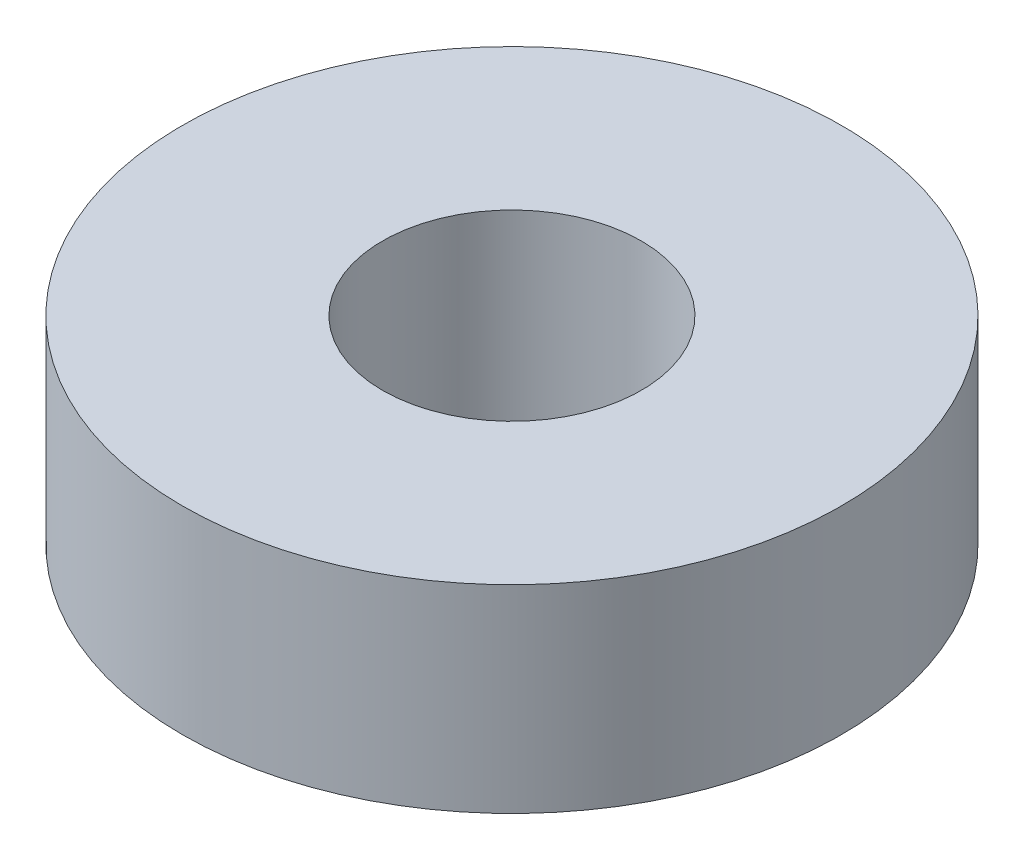
ISO-10303-21;
HEADER;
FILE_DESCRIPTION(('STEP AP214'),'2;1');
FILE_NAME('part.step','',(''),(''),'','','');
FILE_SCHEMA(('AUTOMOTIVE_DESIGN { 1 0 10303 214 1 1 1 1 }'));
ENDSEC;
DATA;
#1=APPLICATION_CONTEXT('core data for automotive mechanical design processes');
#2=APPLICATION_PROTOCOL_DEFINITION('international standard','automotive_design',2000,#1);
#3=PRODUCT_CONTEXT('',#1,'mechanical');
#4=PRODUCT('Part','Part','',(#3));
#5=PRODUCT_RELATED_PRODUCT_CATEGORY('part','',(#4));
#6=PRODUCT_DEFINITION_FORMATION('','',#4);
#7=PRODUCT_DEFINITION_CONTEXT('part definition',#1,'design');
#8=PRODUCT_DEFINITION('design','',#6,#7);
#9=PRODUCT_DEFINITION_SHAPE('','',#8);
#10=(LENGTH_UNIT() NAMED_UNIT(*) SI_UNIT(.MILLI.,.METRE.));
#11=(NAMED_UNIT(*) PLANE_ANGLE_UNIT() SI_UNIT($,.RADIAN.));
#12=(NAMED_UNIT(*) SI_UNIT($,.STERADIAN.) SOLID_ANGLE_UNIT());
#13=UNCERTAINTY_MEASURE_WITH_UNIT(LENGTH_MEASURE(1.E-05),#10,'distance_accuracy_value','');
#14=(GEOMETRIC_REPRESENTATION_CONTEXT(3) GLOBAL_UNCERTAINTY_ASSIGNED_CONTEXT((#13)) GLOBAL_UNIT_ASSIGNED_CONTEXT((#10,
#11,#12)) REPRESENTATION_CONTEXT('',''));
#15=CARTESIAN_POINT('',(0.,0.,0.));
#16=DIRECTION('',(0.,0.,1.));
#17=DIRECTION('',(1.,0.,0.));
#18=AXIS2_PLACEMENT_3D('',#15,#16,#17);
#19=CARTESIAN_POINT('',(0.,6.,0.));
#20=DIRECTION('',(0.,1.,0.));
#21=DIRECTION('',(0.,0.,1.));
#22=AXIS2_PLACEMENT_3D('',#19,#20,#21);
#23=PLANE('',#22);
#24=CARTESIAN_POINT('',(0.,6.,0.));
#25=DIRECTION('',(0.,1.,0.));
#26=DIRECTION('',(0.,0.,1.));
#27=AXIS2_PLACEMENT_3D('',#24,#25,#26);
#28=CIRCLE('',#27,9.98);
#29=CARTESIAN_POINT('',(0.,6.,9.98));
#30=VERTEX_POINT('',#29);
#31=EDGE_CURVE('E11',#30,#30,#28,.T.);
#32=ORIENTED_EDGE('',*,*,#31,.T.);
#33=EDGE_LOOP('',(#32));
#34=FACE_BOUND('',#33,.T.);
#35=CARTESIAN_POINT('',(0.,6.,0.));
#36=DIRECTION('',(0.,1.,0.));
#37=DIRECTION('',(0.,0.,1.));
#38=AXIS2_PLACEMENT_3D('',#35,#36,#37);
#39=CIRCLE('',#38,3.92);
#40=CARTESIAN_POINT('',(0.,6.,3.92));
#41=VERTEX_POINT('',#40);
#42=EDGE_CURVE('E45',#41,#41,#39,.T.);
#43=ORIENTED_EDGE('',*,*,#42,.F.);
#44=EDGE_LOOP('',(#43));
#45=FACE_BOUND('',#44,.T.);
#46=ADVANCED_FACE('F32',(#34,#45),#23,.T.);
#47=CARTESIAN_POINT('',(0.,0.,0.));
#48=DIRECTION('',(0.,1.,0.));
#49=DIRECTION('',(0.,0.,1.));
#50=AXIS2_PLACEMENT_3D('',#47,#48,#49);
#51=PLANE('',#50);
#52=CARTESIAN_POINT('',(0.,0.,0.));
#53=DIRECTION('',(0.,1.,0.));
#54=DIRECTION('',(0.,0.,1.));
#55=AXIS2_PLACEMENT_3D('',#52,#53,#54);
#56=CIRCLE('',#55,9.98);
#57=CARTESIAN_POINT('',(0.,0.,9.98));
#58=VERTEX_POINT('',#57);
#59=EDGE_CURVE('E40',#58,#58,#56,.T.);
#60=ORIENTED_EDGE('',*,*,#59,.F.);
#61=EDGE_LOOP('',(#60));
#62=FACE_BOUND('',#61,.T.);
#63=CARTESIAN_POINT('',(0.,0.,0.));
#64=DIRECTION('',(0.,1.,0.));
#65=DIRECTION('',(0.,0.,1.));
#66=AXIS2_PLACEMENT_3D('',#63,#64,#65);
#67=CIRCLE('',#66,3.92);
#68=CARTESIAN_POINT('',(0.,0.,3.92));
#69=VERTEX_POINT('',#68);
#70=EDGE_CURVE('E36',#69,#69,#67,.T.);
#71=ORIENTED_EDGE('',*,*,#70,.T.);
#72=EDGE_LOOP('',(#71));
#73=FACE_BOUND('',#72,.T.);
#74=ADVANCED_FACE('F53',(#62,#73),#51,.F.);
#75=CARTESIAN_POINT('',(0.,6.,0.));
#76=DIRECTION('',(0.,-1.,0.));
#77=DIRECTION('',(0.,0.,-1.));
#78=AXIS2_PLACEMENT_3D('',#75,#76,#77);
#79=CYLINDRICAL_SURFACE('',#78,9.98);
#80=ORIENTED_EDGE('',*,*,#31,.F.);
#81=EDGE_LOOP('',(#80));
#82=FACE_BOUND('',#81,.T.);
#83=ORIENTED_EDGE('',*,*,#59,.T.);
#84=EDGE_LOOP('',(#83));
#85=FACE_BOUND('',#84,.T.);
#86=ADVANCED_FACE('F56',(#82,#85),#79,.T.);
#87=CARTESIAN_POINT('',(0.,6.,0.));
#88=DIRECTION('',(0.,-1.,0.));
#89=DIRECTION('',(0.,0.,-1.));
#90=AXIS2_PLACEMENT_3D('',#87,#88,#89);
#91=CYLINDRICAL_SURFACE('',#90,3.92);
#92=ORIENTED_EDGE('',*,*,#42,.T.);
#93=EDGE_LOOP('',(#92));
#94=FACE_BOUND('',#93,.T.);
#95=ORIENTED_EDGE('',*,*,#70,.F.);
#96=EDGE_LOOP('',(#95));
#97=FACE_BOUND('',#96,.T.);
#98=ADVANCED_FACE('F34',(#94,#97),#91,.F.);
#99=CLOSED_SHELL('',(#46,#74,#86,#98));
#100=MANIFOLD_SOLID_BREP('B2',#99);
#101=ADVANCED_BREP_SHAPE_REPRESENTATION('',(#18,#100),#14);
#102=SHAPE_DEFINITION_REPRESENTATION(#9,#101);
ENDSEC;
END-ISO-10303-21;
